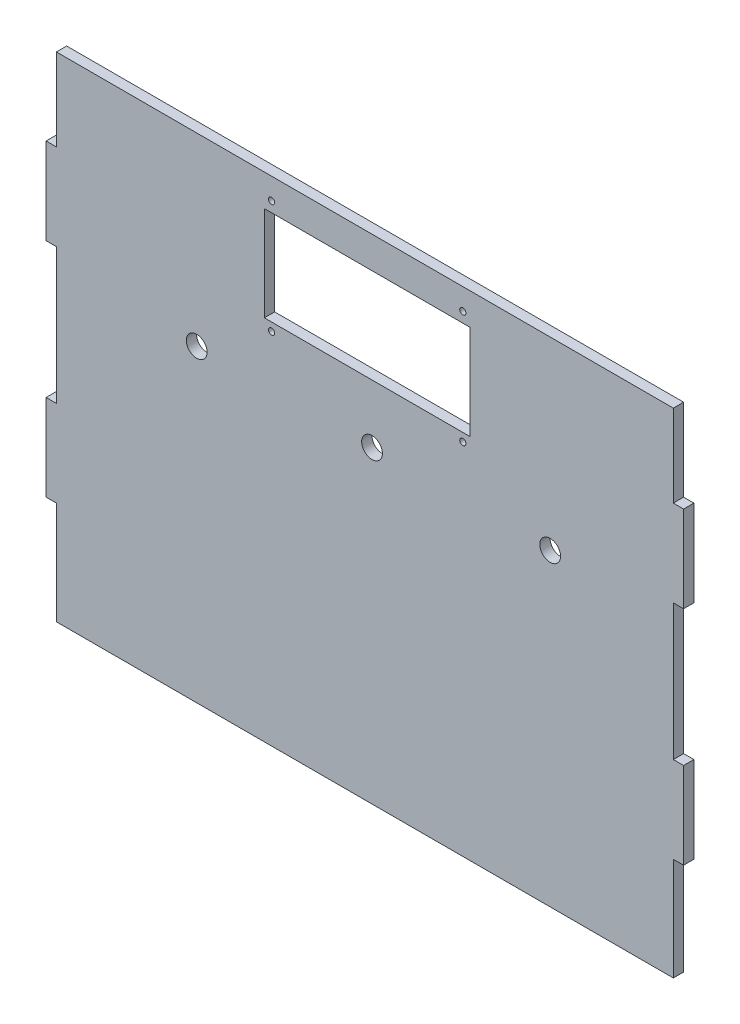
ISO-10303-21;
HEADER;
FILE_DESCRIPTION(('STEP AP214'),'2;1');
FILE_NAME('part.step','',(''),(''),'','','');
FILE_SCHEMA(('AUTOMOTIVE_DESIGN { 1 0 10303 214 1 1 1 1 }'));
ENDSEC;
DATA;
#1=APPLICATION_CONTEXT('core data for automotive mechanical design processes');
#2=APPLICATION_PROTOCOL_DEFINITION('international standard','automotive_design',2000,#1);
#3=PRODUCT_CONTEXT('',#1,'mechanical');
#4=PRODUCT('Part','Part','',(#3));
#5=PRODUCT_RELATED_PRODUCT_CATEGORY('part','',(#4));
#6=PRODUCT_DEFINITION_FORMATION('','',#4);
#7=PRODUCT_DEFINITION_CONTEXT('part definition',#1,'design');
#8=PRODUCT_DEFINITION('design','',#6,#7);
#9=PRODUCT_DEFINITION_SHAPE('','',#8);
#10=(LENGTH_UNIT() NAMED_UNIT(*) SI_UNIT(.MILLI.,.METRE.));
#11=(NAMED_UNIT(*) PLANE_ANGLE_UNIT() SI_UNIT($,.RADIAN.));
#12=(NAMED_UNIT(*) SI_UNIT($,.STERADIAN.) SOLID_ANGLE_UNIT());
#13=UNCERTAINTY_MEASURE_WITH_UNIT(LENGTH_MEASURE(1.E-05),#10,'distance_accuracy_value','');
#14=(GEOMETRIC_REPRESENTATION_CONTEXT(3) GLOBAL_UNCERTAINTY_ASSIGNED_CONTEXT((#13)) GLOBAL_UNIT_ASSIGNED_CONTEXT((#10,
#11,#12)) REPRESENTATION_CONTEXT('',''));
#15=CARTESIAN_POINT('',(0.,0.,0.));
#16=DIRECTION('',(0.,0.,1.));
#17=DIRECTION('',(1.,0.,0.));
#18=AXIS2_PLACEMENT_3D('',#15,#16,#17);
#19=CARTESIAN_POINT('',(0.,0.,5.));
#20=DIRECTION('',(-1.,0.,0.));
#21=DIRECTION('',(0.,0.,1.));
#22=AXIS2_PLACEMENT_3D('',#19,#20,#21);
#23=PLANE('',#22);
#24=DIRECTION('',(0.,1.,0.));
#25=VECTOR('',#24,1.);
#26=CARTESIAN_POINT('',(0.,0.,5.));
#27=LINE('',#26,#25);
#28=CARTESIAN_POINT('',(0.,-148.,5.));
#29=VERTEX_POINT('',#28);
#30=CARTESIAN_POINT('',(0.,-82.,5.));
#31=VERTEX_POINT('',#30);
#32=EDGE_CURVE('E439',#29,#31,#27,.T.);
#33=ORIENTED_EDGE('',*,*,#32,.F.);
#34=CARTESIAN_POINT('',(0.,-148.,5.));
#35=CARTESIAN_POINT('',(0.,-148.,0.));
#36=B_SPLINE_CURVE_WITH_KNOTS('',1,(#34,#35),.UNSPECIFIED.,.F.,.F.,(2,2),(0.,
0.0531914893617021),.UNSPECIFIED.);
#37=CARTESIAN_POINT('',(0.,-148.,0.));
#38=VERTEX_POINT('',#37);
#39=EDGE_CURVE('E299',#29,#38,#36,.T.);
#40=ORIENTED_EDGE('',*,*,#39,.T.);
#41=DIRECTION('',(0.,1.,0.));
#42=VECTOR('',#41,1.);
#43=CARTESIAN_POINT('',(0.,0.,0.));
#44=LINE('',#43,#42);
#45=CARTESIAN_POINT('',(0.,-82.0000000000001,0.));
#46=VERTEX_POINT('',#45);
#47=EDGE_CURVE('E454',#38,#46,#44,.T.);
#48=ORIENTED_EDGE('',*,*,#47,.T.);
#49=CARTESIAN_POINT('',(0.,-82.0000000000001,0.));
#50=CARTESIAN_POINT('',(0.,-82.0000000000001,5.));
#51=B_SPLINE_CURVE_WITH_KNOTS('',1,(#49,#50),.UNSPECIFIED.,.F.,.F.,(2,2),(0.5,
0.553191489361702),.UNSPECIFIED.);
#52=EDGE_CURVE('E331',#46,#31,#51,.T.);
#53=ORIENTED_EDGE('',*,*,#52,.T.);
#54=EDGE_LOOP('',(#33,#40,#48,#53));
#55=FACE_BOUND('',#54,.T.);
#56=ADVANCED_FACE('F93',(#55),#23,.F.);
#57=CARTESIAN_POINT('',(0.,-40.0000000000001,5.));
#58=VERTEX_POINT('',#57);
#59=CARTESIAN_POINT('',(0.,0.,5.));
#60=VERTEX_POINT('',#59);
#61=EDGE_CURVE('E440',#58,#60,#27,.T.);
#62=ORIENTED_EDGE('',*,*,#61,.F.);
#63=CARTESIAN_POINT('',(0.,-40.0000000000001,5.));
#64=CARTESIAN_POINT('',(0.,-40.0000000000001,0.));
#65=B_SPLINE_CURVE_WITH_KNOTS('',1,(#63,#64),.UNSPECIFIED.,.F.,.F.,(2,2),(0.,
0.0531914893617021),.UNSPECIFIED.);
#66=CARTESIAN_POINT('',(0.,-40.0000000000001,0.));
#67=VERTEX_POINT('',#66);
#68=EDGE_CURVE('E330',#58,#67,#65,.T.);
#69=ORIENTED_EDGE('',*,*,#68,.T.);
#70=CARTESIAN_POINT('',(0.,0.,0.));
#71=VERTEX_POINT('',#70);
#72=EDGE_CURVE('E434',#67,#71,#44,.T.);
#73=ORIENTED_EDGE('',*,*,#72,.T.);
#74=DIRECTION('',(0.,0.,-1.));
#75=VECTOR('',#74,1.);
#76=CARTESIAN_POINT('',(0.,0.,5.));
#77=LINE('',#76,#75);
#78=EDGE_CURVE('E471',#60,#71,#77,.T.);
#79=ORIENTED_EDGE('',*,*,#78,.F.);
#80=EDGE_LOOP('',(#62,#69,#73,#79));
#81=FACE_BOUND('',#80,.T.);
#82=ADVANCED_FACE('F536',(#81),#23,.F.);
#83=CARTESIAN_POINT('',(-300.,0.,5.));
#84=DIRECTION('',(1.,0.,0.));
#85=DIRECTION('',(0.,1.,0.));
#86=AXIS2_PLACEMENT_3D('',#83,#84,#85);
#87=PLANE('',#86);
#88=DIRECTION('',(0.,-1.,0.));
#89=VECTOR('',#88,1.);
#90=CARTESIAN_POINT('',(-300.,0.,5.));
#91=LINE('',#90,#89);
#92=CARTESIAN_POINT('',(-300.,-82.,5.));
#93=VERTEX_POINT('',#92);
#94=CARTESIAN_POINT('',(-300.,-148.,5.));
#95=VERTEX_POINT('',#94);
#96=EDGE_CURVE('E447',#93,#95,#91,.T.);
#97=ORIENTED_EDGE('',*,*,#96,.F.);
#98=CARTESIAN_POINT('',(-300.,-82.,5.));
#99=CARTESIAN_POINT('',(-300.,-82.,0.));
#100=B_SPLINE_CURVE_WITH_KNOTS('',1,(#98,#99),.UNSPECIFIED.,.F.,.F.,(2,2),(0.,
0.0531914893617021),.UNSPECIFIED.);
#101=CARTESIAN_POINT('',(-300.,-82.,0.));
#102=VERTEX_POINT('',#101);
#103=EDGE_CURVE('E368',#93,#102,#100,.T.);
#104=ORIENTED_EDGE('',*,*,#103,.T.);
#105=DIRECTION('',(0.,-1.,0.));
#106=VECTOR('',#105,1.);
#107=CARTESIAN_POINT('',(-300.,0.,0.));
#108=LINE('',#107,#106);
#109=CARTESIAN_POINT('',(-300.,-148.,0.));
#110=VERTEX_POINT('',#109);
#111=EDGE_CURVE('E461',#102,#110,#108,.T.);
#112=ORIENTED_EDGE('',*,*,#111,.T.);
#113=CARTESIAN_POINT('',(-300.,-148.,0.));
#114=CARTESIAN_POINT('',(-300.,-148.,5.));
#115=B_SPLINE_CURVE_WITH_KNOTS('',1,(#113,#114),.UNSPECIFIED.,.F.,.F.,(2,2),(0.5,
0.553191489361702),.UNSPECIFIED.);
#116=EDGE_CURVE('E413',#110,#95,#115,.T.);
#117=ORIENTED_EDGE('',*,*,#116,.T.);
#118=EDGE_LOOP('',(#97,#104,#112,#117));
#119=FACE_BOUND('',#118,.T.);
#120=ADVANCED_FACE('F542',(#119),#87,.F.);
#121=CARTESIAN_POINT('',(-300.,-190.,5.));
#122=VERTEX_POINT('',#121);
#123=CARTESIAN_POINT('',(-300.,-240.,5.));
#124=VERTEX_POINT('',#123);
#125=EDGE_CURVE('E442',#122,#124,#91,.T.);
#126=ORIENTED_EDGE('',*,*,#125,.F.);
#127=CARTESIAN_POINT('',(-300.,-190.,5.));
#128=CARTESIAN_POINT('',(-300.,-190.,0.));
#129=B_SPLINE_CURVE_WITH_KNOTS('',1,(#127,#128),.UNSPECIFIED.,.F.,.F.,(2,2),(0.,
0.0531914893617021),.UNSPECIFIED.);
#130=CARTESIAN_POINT('',(-300.,-190.,0.));
#131=VERTEX_POINT('',#130);
#132=EDGE_CURVE('E400',#122,#131,#129,.T.);
#133=ORIENTED_EDGE('',*,*,#132,.T.);
#134=CARTESIAN_POINT('',(-300.,-240.,0.));
#135=VERTEX_POINT('',#134);
#136=EDGE_CURVE('E456',#131,#135,#108,.T.);
#137=ORIENTED_EDGE('',*,*,#136,.T.);
#138=DIRECTION('',(0.,0.,-1.));
#139=VECTOR('',#138,1.);
#140=CARTESIAN_POINT('',(-300.,-240.,5.));
#141=LINE('',#140,#139);
#142=EDGE_CURVE('E465',#124,#135,#141,.T.);
#143=ORIENTED_EDGE('',*,*,#142,.F.);
#144=EDGE_LOOP('',(#126,#133,#137,#143));
#145=FACE_BOUND('',#144,.T.);
#146=ADVANCED_FACE('F547',(#145),#87,.F.);
#147=CARTESIAN_POINT('',(0.,-240.,0.));
#148=VERTEX_POINT('',#147);
#149=CARTESIAN_POINT('',(0.,-190.,0.));
#150=VERTEX_POINT('',#149);
#151=EDGE_CURVE('E450',#148,#150,#44,.T.);
#152=ORIENTED_EDGE('',*,*,#151,.T.);
#153=CARTESIAN_POINT('',(0.,-190.,0.));
#154=CARTESIAN_POINT('',(0.,-190.,5.));
#155=B_SPLINE_CURVE_WITH_KNOTS('',1,(#153,#154),.UNSPECIFIED.,.F.,.F.,(2,2),(0.5,
0.553191489361702),.UNSPECIFIED.);
#156=CARTESIAN_POINT('',(0.,-190.,5.));
#157=VERTEX_POINT('',#156);
#158=EDGE_CURVE('E293',#150,#157,#155,.T.);
#159=ORIENTED_EDGE('',*,*,#158,.T.);
#160=CARTESIAN_POINT('',(0.,-240.,5.));
#161=VERTEX_POINT('',#160);
#162=EDGE_CURVE('E435',#161,#157,#27,.T.);
#163=ORIENTED_EDGE('',*,*,#162,.F.);
#164=DIRECTION('',(0.,0.,-1.));
#165=VECTOR('',#164,1.);
#166=CARTESIAN_POINT('',(0.,-240.,5.));
#167=LINE('',#166,#165);
#168=EDGE_CURVE('E449',#161,#148,#167,.T.);
#169=ORIENTED_EDGE('',*,*,#168,.T.);
#170=EDGE_LOOP('',(#152,#159,#163,#169));
#171=FACE_BOUND('',#170,.T.);
#172=ADVANCED_FACE('F95',(#171),#23,.F.);
#173=CARTESIAN_POINT('',(0.,0.,5.));
#174=DIRECTION('',(0.,-1.,0.));
#175=DIRECTION('',(1.,0.,0.));
#176=AXIS2_PLACEMENT_3D('',#173,#174,#175);
#177=PLANE('',#176);
#178=DIRECTION('',(-1.,0.,0.));
#179=VECTOR('',#178,1.);
#180=CARTESIAN_POINT('',(0.,0.,0.));
#181=LINE('',#180,#179);
#182=CARTESIAN_POINT('',(-300.,0.,0.));
#183=VERTEX_POINT('',#182);
#184=EDGE_CURVE('E453',#71,#183,#181,.T.);
#185=ORIENTED_EDGE('',*,*,#184,.T.);
#186=DIRECTION('',(0.,0.,-1.));
#187=VECTOR('',#186,1.);
#188=CARTESIAN_POINT('',(-300.,0.,5.));
#189=LINE('',#188,#187);
#190=CARTESIAN_POINT('',(-300.,0.,5.));
#191=VERTEX_POINT('',#190);
#192=EDGE_CURVE('E468',#191,#183,#189,.T.);
#193=ORIENTED_EDGE('',*,*,#192,.F.);
#194=DIRECTION('',(-1.,0.,0.));
#195=VECTOR('',#194,1.);
#196=CARTESIAN_POINT('',(0.,0.,5.));
#197=LINE('',#196,#195);
#198=EDGE_CURVE('E438',#60,#191,#197,.T.);
#199=ORIENTED_EDGE('',*,*,#198,.F.);
#200=ORIENTED_EDGE('',*,*,#78,.T.);
#201=EDGE_LOOP('',(#185,#193,#199,#200));
#202=FACE_BOUND('',#201,.T.);
#203=ADVANCED_FACE('F546',(#202),#177,.F.);
#204=CARTESIAN_POINT('',(-300.,-40.,0.));
#205=VERTEX_POINT('',#204);
#206=EDGE_CURVE('E457',#183,#205,#108,.T.);
#207=ORIENTED_EDGE('',*,*,#206,.T.);
#208=CARTESIAN_POINT('',(-300.,-40.,0.));
#209=CARTESIAN_POINT('',(-300.,-40.,5.));
#210=B_SPLINE_CURVE_WITH_KNOTS('',1,(#208,#209),.UNSPECIFIED.,.F.,.F.,(2,2),(0.5,
0.553191489361702),.UNSPECIFIED.);
#211=CARTESIAN_POINT('',(-300.,-40.,5.));
#212=VERTEX_POINT('',#211);
#213=EDGE_CURVE('E381',#205,#212,#210,.T.);
#214=ORIENTED_EDGE('',*,*,#213,.T.);
#215=EDGE_CURVE('E443',#191,#212,#91,.T.);
#216=ORIENTED_EDGE('',*,*,#215,.F.);
#217=ORIENTED_EDGE('',*,*,#192,.T.);
#218=EDGE_LOOP('',(#207,#214,#216,#217));
#219=FACE_BOUND('',#218,.T.);
#220=ADVANCED_FACE('F553',(#219),#87,.F.);
#221=CARTESIAN_POINT('',(0.,-240.,5.));
#222=DIRECTION('',(0.,1.,0.));
#223=DIRECTION('',(-1.,0.,0.));
#224=AXIS2_PLACEMENT_3D('',#221,#222,#223);
#225=PLANE('',#224);
#226=DIRECTION('',(1.,0.,0.));
#227=VECTOR('',#226,1.);
#228=CARTESIAN_POINT('',(0.,-240.,0.));
#229=LINE('',#228,#227);
#230=EDGE_CURVE('E460',#135,#148,#229,.T.);
#231=ORIENTED_EDGE('',*,*,#230,.T.);
#232=ORIENTED_EDGE('',*,*,#168,.F.);
#233=DIRECTION('',(1.,0.,0.));
#234=VECTOR('',#233,1.);
#235=CARTESIAN_POINT('',(0.,-240.,5.));
#236=LINE('',#235,#234);
#237=EDGE_CURVE('E446',#124,#161,#236,.T.);
#238=ORIENTED_EDGE('',*,*,#237,.F.);
#239=ORIENTED_EDGE('',*,*,#142,.T.);
#240=EDGE_LOOP('',(#231,#232,#238,#239));
#241=FACE_BOUND('',#240,.T.);
#242=ADVANCED_FACE('F516',(#241),#225,.F.);
#243=CARTESIAN_POINT('',(0.,0.,5.));
#244=DIRECTION('',(0.,0.,-1.));
#245=DIRECTION('',(-1.,0.,0.));
#246=AXIS2_PLACEMENT_3D('',#243,#244,#245);
#247=PLANE('',#246);
#248=CARTESIAN_POINT('',(-102.365660616639,-65.4074045020585,5.));
#249=DIRECTION('',(0.,0.,1.));
#250=DIRECTION('',(1.,0.,0.));
#251=AXIS2_PLACEMENT_3D('',#248,#249,#250);
#252=CIRCLE('',#251,1.50000000000001);
#253=CARTESIAN_POINT('',(-100.865660616639,-65.4074045020585,5.));
#254=VERTEX_POINT('',#253);
#255=EDGE_CURVE('E502',#254,#254,#252,.T.);
#256=ORIENTED_EDGE('',*,*,#255,.F.);
#257=EDGE_LOOP('',(#256));
#258=FACE_BOUND('',#257,.T.);
#259=CARTESIAN_POINT('',(-195.365660616639,-65.4074045020585,5.));
#260=DIRECTION('',(0.,0.,1.));
#261=DIRECTION('',(1.,0.,0.));
#262=AXIS2_PLACEMENT_3D('',#259,#260,#261);
#263=CIRCLE('',#262,1.50000000000003);
#264=CARTESIAN_POINT('',(-193.865660616639,-65.4074045020585,5.));
#265=VERTEX_POINT('',#264);
#266=EDGE_CURVE('E505',#265,#265,#263,.T.);
#267=ORIENTED_EDGE('',*,*,#266,.F.);
#268=EDGE_LOOP('',(#267));
#269=FACE_BOUND('',#268,.T.);
#270=CARTESIAN_POINT('',(-195.365660616639,-10.4074045020585,5.));
#271=DIRECTION('',(0.,0.,1.));
#272=DIRECTION('',(1.,0.,0.));
#273=AXIS2_PLACEMENT_3D('',#270,#271,#272);
#274=CIRCLE('',#273,1.50000000000003);
#275=CARTESIAN_POINT('',(-193.865660616639,-10.4074045020585,5.));
#276=VERTEX_POINT('',#275);
#277=EDGE_CURVE('E501',#276,#276,#274,.T.);
#278=ORIENTED_EDGE('',*,*,#277,.F.);
#279=EDGE_LOOP('',(#278));
#280=FACE_BOUND('',#279,.T.);
#281=CARTESIAN_POINT('',(-102.365660616639,-10.4074045020585,5.));
#282=DIRECTION('',(0.,0.,1.));
#283=DIRECTION('',(1.,0.,0.));
#284=AXIS2_PLACEMENT_3D('',#281,#282,#283);
#285=CIRCLE('',#284,1.50000000000001);
#286=CARTESIAN_POINT('',(-100.865660616639,-10.4074045020585,5.));
#287=VERTEX_POINT('',#286);
#288=EDGE_CURVE('E489',#287,#287,#285,.T.);
#289=ORIENTED_EDGE('',*,*,#288,.F.);
#290=EDGE_LOOP('',(#289));
#291=FACE_BOUND('',#290,.T.);
#292=DIRECTION('',(0.,1.,0.));
#293=VECTOR('',#292,1.);
#294=CARTESIAN_POINT('',(-198.865660616639,-61.4074045020575,5.));
#295=LINE('',#294,#293);
#296=CARTESIAN_POINT('',(-198.865660616639,-61.4074045020575,5.));
#297=VERTEX_POINT('',#296);
#298=CARTESIAN_POINT('',(-198.865660616639,-15.4074045020575,5.));
#299=VERTEX_POINT('',#298);
#300=EDGE_CURVE('E267',#297,#299,#295,.T.);
#301=ORIENTED_EDGE('',*,*,#300,.T.);
#302=DIRECTION('',(-1.,0.,0.));
#303=VECTOR('',#302,1.);
#304=CARTESIAN_POINT('',(-98.8656606166386,-15.4074045020575,5.));
#305=LINE('',#304,#303);
#306=CARTESIAN_POINT('',(-98.8656606166386,-15.4074045020575,5.));
#307=VERTEX_POINT('',#306);
#308=EDGE_CURVE('E110',#307,#299,#305,.T.);
#309=ORIENTED_EDGE('',*,*,#308,.F.);
#310=DIRECTION('',(0.,1.,0.));
#311=VECTOR('',#310,1.);
#312=CARTESIAN_POINT('',(-98.8656606166386,-61.4074045020575,5.));
#313=LINE('',#312,#311);
#314=CARTESIAN_POINT('',(-98.8656606166386,-61.4074045020575,5.));
#315=VERTEX_POINT('',#314);
#316=EDGE_CURVE('E274',#315,#307,#313,.T.);
#317=ORIENTED_EDGE('',*,*,#316,.F.);
#318=DIRECTION('',(-1.,0.,0.));
#319=VECTOR('',#318,1.);
#320=CARTESIAN_POINT('',(-98.8656606166386,-61.4074045020575,5.));
#321=LINE('',#320,#319);
#322=EDGE_CURVE('E258',#315,#297,#321,.T.);
#323=ORIENTED_EDGE('',*,*,#322,.T.);
#324=EDGE_LOOP('',(#301,#309,#317,#323));
#325=FACE_BOUND('',#324,.T.);
#326=CARTESIAN_POINT('',(-231.788943558068,-89.8542656326558,5.));
#327=DIRECTION('',(0.,0.,1.));
#328=DIRECTION('',(1.,0.,0.));
#329=AXIS2_PLACEMENT_3D('',#326,#327,#328);
#330=CIRCLE('',#329,5.05000000000002);
#331=CARTESIAN_POINT('',(-226.738943558068,-89.8542656326558,5.));
#332=VERTEX_POINT('',#331);
#333=EDGE_CURVE('E284',#332,#332,#330,.T.);
#334=ORIENTED_EDGE('',*,*,#333,.F.);
#335=EDGE_LOOP('',(#334));
#336=FACE_BOUND('',#335,.T.);
#337=CARTESIAN_POINT('',(-146.505843121891,-89.8542656326558,5.));
#338=DIRECTION('',(0.,0.,1.));
#339=DIRECTION('',(1.,0.,0.));
#340=AXIS2_PLACEMENT_3D('',#337,#338,#339);
#341=CIRCLE('',#340,5.04999999999999);
#342=CARTESIAN_POINT('',(-141.455843121891,-89.8542656326558,5.));
#343=VERTEX_POINT('',#342);
#344=EDGE_CURVE('E288',#343,#343,#341,.T.);
#345=ORIENTED_EDGE('',*,*,#344,.F.);
#346=EDGE_LOOP('',(#345));
#347=FACE_BOUND('',#346,.T.);
#348=CARTESIAN_POINT('',(-59.8775833728399,-89.8542656326558,5.));
#349=DIRECTION('',(0.,0.,1.));
#350=DIRECTION('',(1.,0.,0.));
#351=AXIS2_PLACEMENT_3D('',#348,#349,#350);
#352=CIRCLE('',#351,5.04999999999999);
#353=CARTESIAN_POINT('',(-54.8275833728399,-89.8542656326558,5.));
#354=VERTEX_POINT('',#353);
#355=EDGE_CURVE('E281',#354,#354,#352,.T.);
#356=ORIENTED_EDGE('',*,*,#355,.F.);
#357=EDGE_LOOP('',(#356));
#358=FACE_BOUND('',#357,.T.);
#359=ORIENTED_EDGE('',*,*,#162,.T.);
#360=DIRECTION('',(-1.,0.,0.));
#361=VECTOR('',#360,1.);
#362=CARTESIAN_POINT('',(9.9999999995468,-190.,5.));
#363=LINE('',#362,#361);
#364=CARTESIAN_POINT('',(4.99999999999899,-190.,5.));
#365=VERTEX_POINT('',#364);
#366=EDGE_CURVE('E322',#365,#157,#363,.T.);
#367=ORIENTED_EDGE('',*,*,#366,.F.);
#368=DIRECTION('',(0.,1.,0.));
#369=VECTOR('',#368,1.);
#370=CARTESIAN_POINT('',(4.99999999999899,-190.,5.));
#371=LINE('',#370,#369);
#372=CARTESIAN_POINT('',(4.99999999999899,-148.,5.));
#373=VERTEX_POINT('',#372);
#374=EDGE_CURVE('E319',#365,#373,#371,.T.);
#375=ORIENTED_EDGE('',*,*,#374,.T.);
#376=DIRECTION('',(-1.,0.,0.));
#377=VECTOR('',#376,1.);
#378=CARTESIAN_POINT('',(9.9999999995468,-148.,5.));
#379=LINE('',#378,#377);
#380=EDGE_CURVE('E318',#373,#29,#379,.T.);
#381=ORIENTED_EDGE('',*,*,#380,.T.);
#382=ORIENTED_EDGE('',*,*,#32,.T.);
#383=DIRECTION('',(-1.,0.,0.));
#384=VECTOR('',#383,1.);
#385=CARTESIAN_POINT('',(9.9999999995468,-82.0000000000001,5.));
#386=LINE('',#385,#384);
#387=CARTESIAN_POINT('',(4.99999999999899,-82.0000000000001,5.));
#388=VERTEX_POINT('',#387);
#389=EDGE_CURVE('E358',#388,#31,#386,.T.);
#390=ORIENTED_EDGE('',*,*,#389,.F.);
#391=DIRECTION('',(0.,1.,0.));
#392=VECTOR('',#391,1.);
#393=CARTESIAN_POINT('',(4.99999999999899,-82.0000000000001,5.));
#394=LINE('',#393,#392);
#395=CARTESIAN_POINT('',(4.99999999999899,-40.0000000000001,5.));
#396=VERTEX_POINT('',#395);
#397=EDGE_CURVE('E355',#388,#396,#394,.T.);
#398=ORIENTED_EDGE('',*,*,#397,.T.);
#399=DIRECTION('',(-1.,0.,0.));
#400=VECTOR('',#399,1.);
#401=CARTESIAN_POINT('',(9.9999999995468,-40.0000000000001,5.));
#402=LINE('',#401,#400);
#403=EDGE_CURVE('E354',#396,#58,#402,.T.);
#404=ORIENTED_EDGE('',*,*,#403,.T.);
#405=ORIENTED_EDGE('',*,*,#61,.T.);
#406=ORIENTED_EDGE('',*,*,#198,.T.);
#407=ORIENTED_EDGE('',*,*,#215,.T.);
#408=DIRECTION('',(1.,0.,0.));
#409=VECTOR('',#408,1.);
#410=CARTESIAN_POINT('',(-310.000000000001,-40.,5.));
#411=LINE('',#410,#409);
#412=CARTESIAN_POINT('',(-305.,-40.,5.));
#413=VERTEX_POINT('',#412);
#414=EDGE_CURVE('E394',#413,#212,#411,.T.);
#415=ORIENTED_EDGE('',*,*,#414,.F.);
#416=DIRECTION('',(0.,1.,0.));
#417=VECTOR('',#416,1.);
#418=CARTESIAN_POINT('',(-305.,-40.,5.));
#419=LINE('',#418,#417);
#420=CARTESIAN_POINT('',(-305.,-82.,5.));
#421=VERTEX_POINT('',#420);
#422=EDGE_CURVE('E371',#421,#413,#419,.T.);
#423=ORIENTED_EDGE('',*,*,#422,.F.);
#424=DIRECTION('',(1.,0.,0.));
#425=VECTOR('',#424,1.);
#426=CARTESIAN_POINT('',(-310.000000000001,-82.,5.));
#427=LINE('',#426,#425);
#428=EDGE_CURVE('E372',#421,#93,#427,.T.);
#429=ORIENTED_EDGE('',*,*,#428,.T.);
#430=ORIENTED_EDGE('',*,*,#96,.T.);
#431=DIRECTION('',(1.,0.,0.));
#432=VECTOR('',#431,1.);
#433=CARTESIAN_POINT('',(-310.000000000001,-148.,5.));
#434=LINE('',#433,#432);
#435=CARTESIAN_POINT('',(-305.,-148.,5.));
#436=VERTEX_POINT('',#435);
#437=EDGE_CURVE('E426',#436,#95,#434,.T.);
#438=ORIENTED_EDGE('',*,*,#437,.F.);
#439=DIRECTION('',(0.,1.,0.));
#440=VECTOR('',#439,1.);
#441=CARTESIAN_POINT('',(-305.,-148.,5.));
#442=LINE('',#441,#440);
#443=CARTESIAN_POINT('',(-305.,-190.,5.));
#444=VERTEX_POINT('',#443);
#445=EDGE_CURVE('E403',#444,#436,#442,.T.);
#446=ORIENTED_EDGE('',*,*,#445,.F.);
#447=DIRECTION('',(1.,0.,0.));
#448=VECTOR('',#447,1.);
#449=CARTESIAN_POINT('',(-310.000000000001,-190.,5.));
#450=LINE('',#449,#448);
#451=EDGE_CURVE('E404',#444,#122,#450,.T.);
#452=ORIENTED_EDGE('',*,*,#451,.T.);
#453=ORIENTED_EDGE('',*,*,#125,.T.);
#454=ORIENTED_EDGE('',*,*,#237,.T.);
#455=EDGE_LOOP('',(#359,#367,#375,#381,#382,#390,#398,#404,#405,#406,#407,#415,#423,#429,#430,
#438,#446,#452,#453,#454));
#456=FACE_BOUND('',#455,.T.);
#457=ADVANCED_FACE('F271',(#258,#269,#280,#291,#325,#336,#347,#358,#456),#247,.F.);
#458=CARTESIAN_POINT('',(0.,0.,0.));
#459=DIRECTION('',(0.,0.,-1.));
#460=DIRECTION('',(-1.,0.,0.));
#461=AXIS2_PLACEMENT_3D('',#458,#459,#460);
#462=PLANE('',#461);
#463=CARTESIAN_POINT('',(-102.365660616639,-65.4074045020585,0.));
#464=DIRECTION('',(0.,0.,-1.));
#465=DIRECTION('',(-1.,0.,0.));
#466=AXIS2_PLACEMENT_3D('',#463,#464,#465);
#467=CIRCLE('',#466,1.50000000000001);
#468=CARTESIAN_POINT('',(-103.865660616639,-65.4074045020585,0.));
#469=VERTEX_POINT('',#468);
#470=EDGE_CURVE('E97',#469,#469,#467,.T.);
#471=ORIENTED_EDGE('',*,*,#470,.F.);
#472=EDGE_LOOP('',(#471));
#473=FACE_BOUND('',#472,.T.);
#474=CARTESIAN_POINT('',(-195.365660616639,-65.4074045020585,0.));
#475=DIRECTION('',(0.,0.,-1.));
#476=DIRECTION('',(-1.,0.,0.));
#477=AXIS2_PLACEMENT_3D('',#474,#475,#476);
#478=CIRCLE('',#477,1.50000000000003);
#479=CARTESIAN_POINT('',(-196.865660616639,-65.4074045020585,0.));
#480=VERTEX_POINT('',#479);
#481=EDGE_CURVE('E491',#480,#480,#478,.T.);
#482=ORIENTED_EDGE('',*,*,#481,.F.);
#483=EDGE_LOOP('',(#482));
#484=FACE_BOUND('',#483,.T.);
#485=CARTESIAN_POINT('',(-195.365660616639,-10.4074045020585,0.));
#486=DIRECTION('',(0.,0.,-1.));
#487=DIRECTION('',(-1.,0.,0.));
#488=AXIS2_PLACEMENT_3D('',#485,#486,#487);
#489=CIRCLE('',#488,1.50000000000003);
#490=CARTESIAN_POINT('',(-196.865660616639,-10.4074045020585,0.));
#491=VERTEX_POINT('',#490);
#492=EDGE_CURVE('E488',#491,#491,#489,.T.);
#493=ORIENTED_EDGE('',*,*,#492,.F.);
#494=EDGE_LOOP('',(#493));
#495=FACE_BOUND('',#494,.T.);
#496=CARTESIAN_POINT('',(-102.365660616639,-10.4074045020585,0.));
#497=DIRECTION('',(0.,0.,-1.));
#498=DIRECTION('',(-1.,0.,0.));
#499=AXIS2_PLACEMENT_3D('',#496,#497,#498);
#500=CIRCLE('',#499,1.50000000000001);
#501=CARTESIAN_POINT('',(-103.865660616639,-10.4074045020585,0.));
#502=VERTEX_POINT('',#501);
#503=EDGE_CURVE('E485',#502,#502,#500,.T.);
#504=ORIENTED_EDGE('',*,*,#503,.F.);
#505=EDGE_LOOP('',(#504));
#506=FACE_BOUND('',#505,.T.);
#507=DIRECTION('',(1.,0.,0.));
#508=VECTOR('',#507,1.);
#509=CARTESIAN_POINT('',(0.,-15.4074045020575,0.));
#510=LINE('',#509,#508);
#511=CARTESIAN_POINT('',(-198.865660616639,-15.4074045020575,0.));
#512=VERTEX_POINT('',#511);
#513=CARTESIAN_POINT('',(-98.8656606166386,-15.4074045020575,0.));
#514=VERTEX_POINT('',#513);
#515=EDGE_CURVE('E13',#512,#514,#510,.T.);
#516=ORIENTED_EDGE('',*,*,#515,.F.);
#517=DIRECTION('',(0.,-1.,0.));
#518=VECTOR('',#517,1.);
#519=CARTESIAN_POINT('',(-198.865660616639,0.,0.));
#520=LINE('',#519,#518);
#521=CARTESIAN_POINT('',(-198.865660616639,-61.4074045020575,0.));
#522=VERTEX_POINT('',#521);
#523=EDGE_CURVE('E474',#512,#522,#520,.T.);
#524=ORIENTED_EDGE('',*,*,#523,.T.);
#525=DIRECTION('',(1.,0.,0.));
#526=VECTOR('',#525,1.);
#527=CARTESIAN_POINT('',(0.,-61.4074045020575,0.));
#528=LINE('',#527,#526);
#529=CARTESIAN_POINT('',(-98.8656606166386,-61.4074045020575,0.));
#530=VERTEX_POINT('',#529);
#531=EDGE_CURVE('E261',#522,#530,#528,.T.);
#532=ORIENTED_EDGE('',*,*,#531,.T.);
#533=DIRECTION('',(0.,-1.,0.));
#534=VECTOR('',#533,1.);
#535=CARTESIAN_POINT('',(-98.8656606166386,0.,0.));
#536=LINE('',#535,#534);
#537=EDGE_CURVE('E102',#514,#530,#536,.T.);
#538=ORIENTED_EDGE('',*,*,#537,.F.);
#539=EDGE_LOOP('',(#516,#524,#532,#538));
#540=FACE_BOUND('',#539,.T.);
#541=CARTESIAN_POINT('',(-231.788943558068,-89.8542656326558,0.));
#542=DIRECTION('',(0.,0.,-1.));
#543=DIRECTION('',(-1.,0.,0.));
#544=AXIS2_PLACEMENT_3D('',#541,#542,#543);
#545=CIRCLE('',#544,5.05000000000002);
#546=CARTESIAN_POINT('',(-236.838943558068,-89.8542656326558,0.));
#547=VERTEX_POINT('',#546);
#548=EDGE_CURVE('E307',#547,#547,#545,.T.);
#549=ORIENTED_EDGE('',*,*,#548,.F.);
#550=EDGE_LOOP('',(#549));
#551=FACE_BOUND('',#550,.T.);
#552=CARTESIAN_POINT('',(-146.505843121891,-89.8542656326558,0.));
#553=DIRECTION('',(0.,0.,-1.));
#554=DIRECTION('',(-1.,0.,0.));
#555=AXIS2_PLACEMENT_3D('',#552,#553,#554);
#556=CIRCLE('',#555,5.04999999999999);
#557=CARTESIAN_POINT('',(-151.555843121891,-89.8542656326558,0.));
#558=VERTEX_POINT('',#557);
#559=EDGE_CURVE('E477',#558,#558,#556,.T.);
#560=ORIENTED_EDGE('',*,*,#559,.F.);
#561=EDGE_LOOP('',(#560));
#562=FACE_BOUND('',#561,.T.);
#563=CARTESIAN_POINT('',(-59.8775833728399,-89.8542656326558,0.));
#564=DIRECTION('',(0.,0.,-1.));
#565=DIRECTION('',(-1.,0.,0.));
#566=AXIS2_PLACEMENT_3D('',#563,#564,#565);
#567=CIRCLE('',#566,5.04999999999999);
#568=CARTESIAN_POINT('',(-64.9275833728399,-89.8542656326558,0.));
#569=VERTEX_POINT('',#568);
#570=EDGE_CURVE('E287',#569,#569,#567,.T.);
#571=ORIENTED_EDGE('',*,*,#570,.F.);
#572=EDGE_LOOP('',(#571));
#573=FACE_BOUND('',#572,.T.);
#574=ORIENTED_EDGE('',*,*,#151,.F.);
#575=ORIENTED_EDGE('',*,*,#230,.F.);
#576=ORIENTED_EDGE('',*,*,#136,.F.);
#577=DIRECTION('',(1.,0.,0.));
#578=VECTOR('',#577,1.);
#579=CARTESIAN_POINT('',(-310.000000000001,-190.,0.));
#580=LINE('',#579,#578);
#581=CARTESIAN_POINT('',(-305.,-190.,0.));
#582=VERTEX_POINT('',#581);
#583=EDGE_CURVE('E421',#582,#131,#580,.T.);
#584=ORIENTED_EDGE('',*,*,#583,.F.);
#585=DIRECTION('',(0.,-1.,0.));
#586=VECTOR('',#585,1.);
#587=CARTESIAN_POINT('',(-305.,-190.,0.));
#588=LINE('',#587,#586);
#589=CARTESIAN_POINT('',(-305.,-148.,0.));
#590=VERTEX_POINT('',#589);
#591=EDGE_CURVE('E408',#590,#582,#588,.T.);
#592=ORIENTED_EDGE('',*,*,#591,.F.);
#593=DIRECTION('',(1.,0.,0.));
#594=VECTOR('',#593,1.);
#595=CARTESIAN_POINT('',(-310.000000000001,-148.,0.));
#596=LINE('',#595,#594);
#597=EDGE_CURVE('E429',#590,#110,#596,.T.);
#598=ORIENTED_EDGE('',*,*,#597,.T.);
#599=ORIENTED_EDGE('',*,*,#111,.F.);
#600=DIRECTION('',(1.,0.,0.));
#601=VECTOR('',#600,1.);
#602=CARTESIAN_POINT('',(-310.000000000001,-82.,0.));
#603=LINE('',#602,#601);
#604=CARTESIAN_POINT('',(-305.,-82.,0.));
#605=VERTEX_POINT('',#604);
#606=EDGE_CURVE('E389',#605,#102,#603,.T.);
#607=ORIENTED_EDGE('',*,*,#606,.F.);
#608=DIRECTION('',(0.,-1.,0.));
#609=VECTOR('',#608,1.);
#610=CARTESIAN_POINT('',(-305.,-82.,0.));
#611=LINE('',#610,#609);
#612=CARTESIAN_POINT('',(-305.,-40.,0.));
#613=VERTEX_POINT('',#612);
#614=EDGE_CURVE('E376',#613,#605,#611,.T.);
#615=ORIENTED_EDGE('',*,*,#614,.F.);
#616=DIRECTION('',(1.,0.,0.));
#617=VECTOR('',#616,1.);
#618=CARTESIAN_POINT('',(-310.000000000001,-40.,0.));
#619=LINE('',#618,#617);
#620=EDGE_CURVE('E396',#613,#205,#619,.T.);
#621=ORIENTED_EDGE('',*,*,#620,.T.);
#622=ORIENTED_EDGE('',*,*,#206,.F.);
#623=ORIENTED_EDGE('',*,*,#184,.F.);
#624=ORIENTED_EDGE('',*,*,#72,.F.);
#625=DIRECTION('',(-1.,0.,0.));
#626=VECTOR('',#625,1.);
#627=CARTESIAN_POINT('',(9.9999999995468,-40.0000000000001,0.));
#628=LINE('',#627,#626);
#629=CARTESIAN_POINT('',(4.999999999999,-40.0000000000001,0.));
#630=VERTEX_POINT('',#629);
#631=EDGE_CURVE('E353',#630,#67,#628,.T.);
#632=ORIENTED_EDGE('',*,*,#631,.F.);
#633=DIRECTION('',(0.,-1.,0.));
#634=VECTOR('',#633,1.);
#635=CARTESIAN_POINT('',(4.999999999999,-40.0000000000001,0.));
#636=LINE('',#635,#634);
#637=CARTESIAN_POINT('',(4.99999999999901,-82.0000000000001,0.));
#638=VERTEX_POINT('',#637);
#639=EDGE_CURVE('E336',#630,#638,#636,.T.);
#640=ORIENTED_EDGE('',*,*,#639,.T.);
#641=DIRECTION('',(-1.,0.,0.));
#642=VECTOR('',#641,1.);
#643=CARTESIAN_POINT('',(9.9999999995468,-82.0000000000001,0.));
#644=LINE('',#643,#642);
#645=EDGE_CURVE('E349',#638,#46,#644,.T.);
#646=ORIENTED_EDGE('',*,*,#645,.T.);
#647=ORIENTED_EDGE('',*,*,#47,.F.);
#648=DIRECTION('',(-1.,0.,0.));
#649=VECTOR('',#648,1.);
#650=CARTESIAN_POINT('',(9.9999999995468,-148.,0.));
#651=LINE('',#650,#649);
#652=CARTESIAN_POINT('',(4.999999999999,-148.,0.));
#653=VERTEX_POINT('',#652);
#654=EDGE_CURVE('E317',#653,#38,#651,.T.);
#655=ORIENTED_EDGE('',*,*,#654,.F.);
#656=DIRECTION('',(0.,-1.,0.));
#657=VECTOR('',#656,1.);
#658=CARTESIAN_POINT('',(4.999999999999,-148.,0.));
#659=LINE('',#658,#657);
#660=CARTESIAN_POINT('',(4.99999999999901,-190.,0.));
#661=VERTEX_POINT('',#660);
#662=EDGE_CURVE('E298',#653,#661,#659,.T.);
#663=ORIENTED_EDGE('',*,*,#662,.T.);
#664=DIRECTION('',(-1.,0.,0.));
#665=VECTOR('',#664,1.);
#666=CARTESIAN_POINT('',(9.9999999995468,-190.,0.));
#667=LINE('',#666,#665);
#668=EDGE_CURVE('E313',#661,#150,#667,.T.);
#669=ORIENTED_EDGE('',*,*,#668,.T.);
#670=EDGE_LOOP('',(#574,#575,#576,#584,#592,#598,#599,#607,#615,#621,#622,#623,#624,#632,#640,
#646,#647,#655,#663,#669));
#671=FACE_BOUND('',#670,.T.);
#672=ADVANCED_FACE('F515',(#473,#484,#495,#506,#540,#551,#562,#573,#671),#462,.T.);
#673=CARTESIAN_POINT('',(-310.000000000001,-190.,5.));
#674=DIRECTION('',(0.,-1.,0.));
#675=DIRECTION('',(1.,0.,0.));
#676=AXIS2_PLACEMENT_3D('',#673,#674,#675);
#677=PLANE('',#676);
#678=DIRECTION('',(0.,0.,1.));
#679=VECTOR('',#678,1.);
#680=CARTESIAN_POINT('',(-305.,-190.,4.99999999999998));
#681=LINE('',#680,#679);
#682=EDGE_CURVE('E406',#582,#444,#681,.T.);
#683=ORIENTED_EDGE('',*,*,#682,.F.);
#684=ORIENTED_EDGE('',*,*,#583,.T.);
#685=ORIENTED_EDGE('',*,*,#132,.F.);
#686=ORIENTED_EDGE('',*,*,#451,.F.);
#687=EDGE_LOOP('',(#683,#684,#685,#686));
#688=FACE_BOUND('',#687,.T.);
#689=ADVANCED_FACE('F648',(#688),#677,.T.);
#690=CARTESIAN_POINT('',(-310.000000000001,-148.,0.));
#691=DIRECTION('',(0.,1.,0.));
#692=DIRECTION('',(-1.,0.,0.));
#693=AXIS2_PLACEMENT_3D('',#690,#691,#692);
#694=PLANE('',#693);
#695=DIRECTION('',(0.,0.,-1.));
#696=VECTOR('',#695,1.);
#697=CARTESIAN_POINT('',(-305.,-148.,0.));
#698=LINE('',#697,#696);
#699=EDGE_CURVE('E401',#436,#590,#698,.T.);
#700=ORIENTED_EDGE('',*,*,#699,.F.);
#701=ORIENTED_EDGE('',*,*,#437,.T.);
#702=ORIENTED_EDGE('',*,*,#116,.F.);
#703=ORIENTED_EDGE('',*,*,#597,.F.);
#704=EDGE_LOOP('',(#700,#701,#702,#703));
#705=FACE_BOUND('',#704,.T.);
#706=ADVANCED_FACE('F587',(#705),#694,.T.);
#707=CARTESIAN_POINT('',(-305.000000000001,-3.85802501057242E-12,-24.999999999996));
#708=DIRECTION('',(1.,0.,0.));
#709=DIRECTION('',(0.,0.,-1.));
#710=AXIS2_PLACEMENT_3D('',#707,#708,#709);
#711=PLANE('',#710);
#712=ORIENTED_EDGE('',*,*,#682,.T.);
#713=ORIENTED_EDGE('',*,*,#445,.T.);
#714=ORIENTED_EDGE('',*,*,#699,.T.);
#715=ORIENTED_EDGE('',*,*,#591,.T.);
#716=EDGE_LOOP('',(#712,#713,#714,#715));
#717=FACE_BOUND('',#716,.T.);
#718=ADVANCED_FACE('F642',(#717),#711,.F.);
#719=CARTESIAN_POINT('',(-310.000000000001,-82.,5.));
#720=DIRECTION('',(0.,-1.,0.));
#721=DIRECTION('',(1.,0.,0.));
#722=AXIS2_PLACEMENT_3D('',#719,#720,#721);
#723=PLANE('',#722);
#724=DIRECTION('',(0.,0.,1.));
#725=VECTOR('',#724,1.);
#726=CARTESIAN_POINT('',(-305.,-82.,4.99999999999998));
#727=LINE('',#726,#725);
#728=EDGE_CURVE('E374',#605,#421,#727,.T.);
#729=ORIENTED_EDGE('',*,*,#728,.F.);
#730=ORIENTED_EDGE('',*,*,#606,.T.);
#731=ORIENTED_EDGE('',*,*,#103,.F.);
#732=ORIENTED_EDGE('',*,*,#428,.F.);
#733=EDGE_LOOP('',(#729,#730,#731,#732));
#734=FACE_BOUND('',#733,.T.);
#735=ADVANCED_FACE('F596',(#734),#723,.T.);
#736=CARTESIAN_POINT('',(-310.000000000001,-40.,0.));
#737=DIRECTION('',(0.,1.,0.));
#738=DIRECTION('',(-1.,0.,0.));
#739=AXIS2_PLACEMENT_3D('',#736,#737,#738);
#740=PLANE('',#739);
#741=DIRECTION('',(0.,0.,-1.));
#742=VECTOR('',#741,1.);
#743=CARTESIAN_POINT('',(-305.,-40.,0.));
#744=LINE('',#743,#742);
#745=EDGE_CURVE('E369',#413,#613,#744,.T.);
#746=ORIENTED_EDGE('',*,*,#745,.F.);
#747=ORIENTED_EDGE('',*,*,#414,.T.);
#748=ORIENTED_EDGE('',*,*,#213,.F.);
#749=ORIENTED_EDGE('',*,*,#620,.F.);
#750=EDGE_LOOP('',(#746,#747,#748,#749));
#751=FACE_BOUND('',#750,.T.);
#752=ADVANCED_FACE('F605',(#751),#740,.T.);
#753=CARTESIAN_POINT('',(-305.000000000001,-3.85802501057242E-12,-24.999999999996));
#754=DIRECTION('',(1.,0.,0.));
#755=DIRECTION('',(0.,0.,-1.));
#756=AXIS2_PLACEMENT_3D('',#753,#754,#755);
#757=PLANE('',#756);
#758=ORIENTED_EDGE('',*,*,#728,.T.);
#759=ORIENTED_EDGE('',*,*,#422,.T.);
#760=ORIENTED_EDGE('',*,*,#745,.T.);
#761=ORIENTED_EDGE('',*,*,#614,.T.);
#762=EDGE_LOOP('',(#758,#759,#760,#761));
#763=FACE_BOUND('',#762,.T.);
#764=ADVANCED_FACE('F602',(#763),#757,.F.);
#765=CARTESIAN_POINT('',(4.99999999999909,-3.83026943495679E-12,-24.9999999999962));
#766=DIRECTION('',(1.,0.,0.));
#767=DIRECTION('',(0.,0.,-1.));
#768=AXIS2_PLACEMENT_3D('',#765,#766,#767);
#769=PLANE('',#768);
#770=DIRECTION('',(0.,0.,-1.));
#771=VECTOR('',#770,1.);
#772=CARTESIAN_POINT('',(4.99999999999899,-40.0000000000001,4.99999999999998));
#773=LINE('',#772,#771);
#774=EDGE_CURVE('E350',#396,#630,#773,.T.);
#775=ORIENTED_EDGE('',*,*,#774,.F.);
#776=ORIENTED_EDGE('',*,*,#397,.F.);
#777=DIRECTION('',(0.,0.,1.));
#778=VECTOR('',#777,1.);
#779=CARTESIAN_POINT('',(4.999999999999,-82.0000000000001,0.));
#780=LINE('',#779,#778);
#781=EDGE_CURVE('E359',#638,#388,#780,.T.);
#782=ORIENTED_EDGE('',*,*,#781,.F.);
#783=ORIENTED_EDGE('',*,*,#639,.F.);
#784=EDGE_LOOP('',(#775,#776,#782,#783));
#785=FACE_BOUND('',#784,.T.);
#786=ADVANCED_FACE('F628',(#785),#769,.T.);
#787=CARTESIAN_POINT('',(9.9999999995468,-82.0000000000001,0.));
#788=DIRECTION('',(0.,-1.,0.));
#789=DIRECTION('',(0.,0.,-1.));
#790=AXIS2_PLACEMENT_3D('',#787,#788,#789);
#791=PLANE('',#790);
#792=ORIENTED_EDGE('',*,*,#645,.F.);
#793=ORIENTED_EDGE('',*,*,#781,.T.);
#794=ORIENTED_EDGE('',*,*,#389,.T.);
#795=ORIENTED_EDGE('',*,*,#52,.F.);
#796=EDGE_LOOP('',(#792,#793,#794,#795));
#797=FACE_BOUND('',#796,.T.);
#798=ADVANCED_FACE('F621',(#797),#791,.T.);
#799=CARTESIAN_POINT('',(9.9999999995468,-40.0000000000001,5.));
#800=DIRECTION('',(0.,1.,0.));
#801=DIRECTION('',(0.,0.,1.));
#802=AXIS2_PLACEMENT_3D('',#799,#800,#801);
#803=PLANE('',#802);
#804=ORIENTED_EDGE('',*,*,#403,.F.);
#805=ORIENTED_EDGE('',*,*,#774,.T.);
#806=ORIENTED_EDGE('',*,*,#631,.T.);
#807=ORIENTED_EDGE('',*,*,#68,.F.);
#808=EDGE_LOOP('',(#804,#805,#806,#807));
#809=FACE_BOUND('',#808,.T.);
#810=ADVANCED_FACE('F626',(#809),#803,.T.);
#811=CARTESIAN_POINT('',(4.99999999999909,-3.83026943495679E-12,-24.9999999999962));
#812=DIRECTION('',(1.,0.,0.));
#813=DIRECTION('',(0.,0.,-1.));
#814=AXIS2_PLACEMENT_3D('',#811,#812,#813);
#815=PLANE('',#814);
#816=DIRECTION('',(0.,0.,-1.));
#817=VECTOR('',#816,1.);
#818=CARTESIAN_POINT('',(4.99999999999899,-148.,4.99999999999998));
#819=LINE('',#818,#817);
#820=EDGE_CURVE('E314',#373,#653,#819,.T.);
#821=ORIENTED_EDGE('',*,*,#820,.F.);
#822=ORIENTED_EDGE('',*,*,#374,.F.);
#823=DIRECTION('',(0.,0.,1.));
#824=VECTOR('',#823,1.);
#825=CARTESIAN_POINT('',(4.999999999999,-190.,0.));
#826=LINE('',#825,#824);
#827=EDGE_CURVE('E323',#661,#365,#826,.T.);
#828=ORIENTED_EDGE('',*,*,#827,.F.);
#829=ORIENTED_EDGE('',*,*,#662,.F.);
#830=EDGE_LOOP('',(#821,#822,#828,#829));
#831=FACE_BOUND('',#830,.T.);
#832=ADVANCED_FACE('F795',(#831),#815,.T.);
#833=CARTESIAN_POINT('',(9.9999999995468,-190.,0.));
#834=DIRECTION('',(0.,-1.,0.));
#835=DIRECTION('',(0.,0.,-1.));
#836=AXIS2_PLACEMENT_3D('',#833,#834,#835);
#837=PLANE('',#836);
#838=ORIENTED_EDGE('',*,*,#668,.F.);
#839=ORIENTED_EDGE('',*,*,#827,.T.);
#840=ORIENTED_EDGE('',*,*,#366,.T.);
#841=ORIENTED_EDGE('',*,*,#158,.F.);
#842=EDGE_LOOP('',(#838,#839,#840,#841));
#843=FACE_BOUND('',#842,.T.);
#844=ADVANCED_FACE('F568',(#843),#837,.T.);
#845=CARTESIAN_POINT('',(9.9999999995468,-148.,5.));
#846=DIRECTION('',(0.,1.,0.));
#847=DIRECTION('',(0.,0.,1.));
#848=AXIS2_PLACEMENT_3D('',#845,#846,#847);
#849=PLANE('',#848);
#850=ORIENTED_EDGE('',*,*,#380,.F.);
#851=ORIENTED_EDGE('',*,*,#820,.T.);
#852=ORIENTED_EDGE('',*,*,#654,.T.);
#853=ORIENTED_EDGE('',*,*,#39,.F.);
#854=EDGE_LOOP('',(#850,#851,#852,#853));
#855=FACE_BOUND('',#854,.T.);
#856=ADVANCED_FACE('F814',(#855),#849,.T.);
#857=CARTESIAN_POINT('',(-59.8775833728399,-89.8542656326558,-5.));
#858=DIRECTION('',(0.,0.,1.));
#859=DIRECTION('',(1.,0.,0.));
#860=AXIS2_PLACEMENT_3D('',#857,#858,#859);
#861=CYLINDRICAL_SURFACE('',#860,5.04999999999999);
#862=ORIENTED_EDGE('',*,*,#570,.T.);
#863=EDGE_LOOP('',(#862));
#864=FACE_BOUND('',#863,.T.);
#865=ORIENTED_EDGE('',*,*,#355,.T.);
#866=EDGE_LOOP('',(#865));
#867=FACE_BOUND('',#866,.T.);
#868=ADVANCED_FACE('F824',(#864,#867),#861,.F.);
#869=CARTESIAN_POINT('',(-146.505843121891,-89.8542656326558,-5.));
#870=DIRECTION('',(0.,0.,1.));
#871=DIRECTION('',(1.,0.,0.));
#872=AXIS2_PLACEMENT_3D('',#869,#870,#871);
#873=CYLINDRICAL_SURFACE('',#872,5.04999999999999);
#874=ORIENTED_EDGE('',*,*,#559,.T.);
#875=EDGE_LOOP('',(#874));
#876=FACE_BOUND('',#875,.T.);
#877=ORIENTED_EDGE('',*,*,#344,.T.);
#878=EDGE_LOOP('',(#877));
#879=FACE_BOUND('',#878,.T.);
#880=ADVANCED_FACE('F834',(#876,#879),#873,.F.);
#881=CARTESIAN_POINT('',(-231.788943558068,-89.8542656326558,-5.));
#882=DIRECTION('',(0.,0.,1.));
#883=DIRECTION('',(1.,0.,0.));
#884=AXIS2_PLACEMENT_3D('',#881,#882,#883);
#885=CYLINDRICAL_SURFACE('',#884,5.05000000000002);
#886=ORIENTED_EDGE('',*,*,#548,.T.);
#887=EDGE_LOOP('',(#886));
#888=FACE_BOUND('',#887,.T.);
#889=ORIENTED_EDGE('',*,*,#333,.T.);
#890=EDGE_LOOP('',(#889));
#891=FACE_BOUND('',#890,.T.);
#892=ADVANCED_FACE('F843',(#888,#891),#885,.F.);
#893=CARTESIAN_POINT('',(-98.8656606166386,-15.4074045020575,-5.));
#894=DIRECTION('',(0.,1.,0.));
#895=DIRECTION('',(-1.,0.,0.));
#896=AXIS2_PLACEMENT_3D('',#893,#894,#895);
#897=PLANE('',#896);
#898=ORIENTED_EDGE('',*,*,#515,.T.);
#899=DIRECTION('',(0.,0.,1.));
#900=VECTOR('',#899,1.);
#901=CARTESIAN_POINT('',(-98.8656606166386,-15.4074045020575,-5.));
#902=LINE('',#901,#900);
#903=EDGE_CURVE('E279',#514,#307,#902,.T.);
#904=ORIENTED_EDGE('',*,*,#903,.T.);
#905=ORIENTED_EDGE('',*,*,#308,.T.);
#906=DIRECTION('',(0.,0.,1.));
#907=VECTOR('',#906,1.);
#908=CARTESIAN_POINT('',(-198.865660616639,-15.4074045020575,-5.));
#909=LINE('',#908,#907);
#910=EDGE_CURVE('E264',#512,#299,#909,.T.);
#911=ORIENTED_EDGE('',*,*,#910,.F.);
#912=EDGE_LOOP('',(#898,#904,#905,#911));
#913=FACE_BOUND('',#912,.T.);
#914=ADVANCED_FACE('F852',(#913),#897,.F.);
#915=CARTESIAN_POINT('',(-98.8656606166386,-61.4074045020575,-5.));
#916=DIRECTION('',(1.,0.,0.));
#917=DIRECTION('',(0.,0.,-1.));
#918=AXIS2_PLACEMENT_3D('',#915,#916,#917);
#919=PLANE('',#918);
#920=ORIENTED_EDGE('',*,*,#537,.T.);
#921=DIRECTION('',(0.,0.,1.));
#922=VECTOR('',#921,1.);
#923=CARTESIAN_POINT('',(-98.8656606166386,-61.4074045020575,-5.));
#924=LINE('',#923,#922);
#925=EDGE_CURVE('E263',#530,#315,#924,.T.);
#926=ORIENTED_EDGE('',*,*,#925,.T.);
#927=ORIENTED_EDGE('',*,*,#316,.T.);
#928=ORIENTED_EDGE('',*,*,#903,.F.);
#929=EDGE_LOOP('',(#920,#926,#927,#928));
#930=FACE_BOUND('',#929,.T.);
#931=ADVANCED_FACE('F861',(#930),#919,.F.);
#932=CARTESIAN_POINT('',(-98.8656606166386,-61.4074045020575,-5.));
#933=DIRECTION('',(0.,1.,0.));
#934=DIRECTION('',(-1.,0.,0.));
#935=AXIS2_PLACEMENT_3D('',#932,#933,#934);
#936=PLANE('',#935);
#937=DIRECTION('',(0.,0.,1.));
#938=VECTOR('',#937,1.);
#939=CARTESIAN_POINT('',(-198.865660616639,-61.4074045020575,-5.));
#940=LINE('',#939,#938);
#941=EDGE_CURVE('E118',#522,#297,#940,.T.);
#942=ORIENTED_EDGE('',*,*,#941,.T.);
#943=ORIENTED_EDGE('',*,*,#322,.F.);
#944=ORIENTED_EDGE('',*,*,#925,.F.);
#945=ORIENTED_EDGE('',*,*,#531,.F.);
#946=EDGE_LOOP('',(#942,#943,#944,#945));
#947=FACE_BOUND('',#946,.T.);
#948=ADVANCED_FACE('F255',(#947),#936,.T.);
#949=CARTESIAN_POINT('',(-198.865660616639,-61.4074045020575,-5.));
#950=DIRECTION('',(1.,0.,0.));
#951=DIRECTION('',(0.,0.,-1.));
#952=AXIS2_PLACEMENT_3D('',#949,#950,#951);
#953=PLANE('',#952);
#954=ORIENTED_EDGE('',*,*,#910,.T.);
#955=ORIENTED_EDGE('',*,*,#300,.F.);
#956=ORIENTED_EDGE('',*,*,#941,.F.);
#957=ORIENTED_EDGE('',*,*,#523,.F.);
#958=EDGE_LOOP('',(#954,#955,#956,#957));
#959=FACE_BOUND('',#958,.T.);
#960=ADVANCED_FACE('F268',(#959),#953,.T.);
#961=CARTESIAN_POINT('',(-102.365660616639,-10.4074045020585,-5.));
#962=DIRECTION('',(0.,0.,1.));
#963=DIRECTION('',(1.,0.,0.));
#964=AXIS2_PLACEMENT_3D('',#961,#962,#963);
#965=CYLINDRICAL_SURFACE('',#964,1.50000000000001);
#966=ORIENTED_EDGE('',*,*,#503,.T.);
#967=EDGE_LOOP('',(#966));
#968=FACE_BOUND('',#967,.T.);
#969=ORIENTED_EDGE('',*,*,#288,.T.);
#970=EDGE_LOOP('',(#969));
#971=FACE_BOUND('',#970,.T.);
#972=ADVANCED_FACE('F521',(#968,#971),#965,.F.);
#973=CARTESIAN_POINT('',(-195.365660616639,-10.4074045020585,-5.));
#974=DIRECTION('',(0.,0.,1.));
#975=DIRECTION('',(1.,0.,0.));
#976=AXIS2_PLACEMENT_3D('',#973,#974,#975);
#977=CYLINDRICAL_SURFACE('',#976,1.50000000000003);
#978=ORIENTED_EDGE('',*,*,#492,.T.);
#979=EDGE_LOOP('',(#978));
#980=FACE_BOUND('',#979,.T.);
#981=ORIENTED_EDGE('',*,*,#277,.T.);
#982=EDGE_LOOP('',(#981));
#983=FACE_BOUND('',#982,.T.);
#984=ADVANCED_FACE('F511',(#980,#983),#977,.F.);
#985=CARTESIAN_POINT('',(-195.365660616639,-65.4074045020585,-5.));
#986=DIRECTION('',(0.,0.,1.));
#987=DIRECTION('',(1.,0.,0.));
#988=AXIS2_PLACEMENT_3D('',#985,#986,#987);
#989=CYLINDRICAL_SURFACE('',#988,1.50000000000003);
#990=ORIENTED_EDGE('',*,*,#481,.T.);
#991=EDGE_LOOP('',(#990));
#992=FACE_BOUND('',#991,.T.);
#993=ORIENTED_EDGE('',*,*,#266,.T.);
#994=EDGE_LOOP('',(#993));
#995=FACE_BOUND('',#994,.T.);
#996=ADVANCED_FACE('F529',(#992,#995),#989,.F.);
#997=CARTESIAN_POINT('',(-102.365660616639,-65.4074045020585,-5.));
#998=DIRECTION('',(0.,0.,1.));
#999=DIRECTION('',(1.,0.,0.));
#1000=AXIS2_PLACEMENT_3D('',#997,#998,#999);
#1001=CYLINDRICAL_SURFACE('',#1000,1.50000000000001);
#1002=ORIENTED_EDGE('',*,*,#470,.T.);
#1003=EDGE_LOOP('',(#1002));
#1004=FACE_BOUND('',#1003,.T.);
#1005=ORIENTED_EDGE('',*,*,#255,.T.);
#1006=EDGE_LOOP('',(#1005));
#1007=FACE_BOUND('',#1006,.T.);
#1008=ADVANCED_FACE('F897',(#1004,#1007),#1001,.F.);
#1009=CLOSED_SHELL('',(#56,#82,#120,#146,#172,#203,#220,#242,#457,#672,#689,#706,#718,#735,#752,
#764,#786,#798,#810,#832,#844,#856,#868,#880,#892,#914,#931,#948,#960,#972,#984,#996,#1008));
#1010=MANIFOLD_SOLID_BREP('B2',#1009);
#1011=ADVANCED_BREP_SHAPE_REPRESENTATION('',(#18,#1010),#14);
#1012=SHAPE_DEFINITION_REPRESENTATION(#9,#1011);
ENDSEC;
END-ISO-10303-21;
